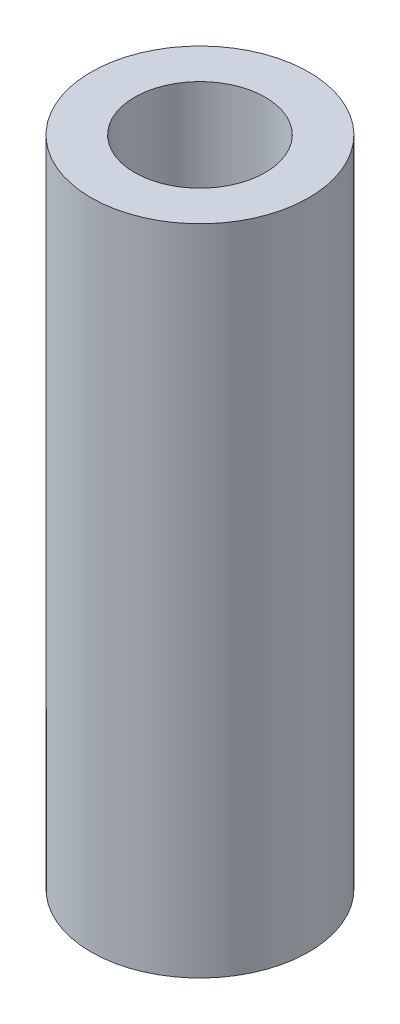
ISO-10303-21;
HEADER;
FILE_DESCRIPTION(('STEP AP214'),'2;1');
FILE_NAME('part.step','',(''),(''),'','','');
FILE_SCHEMA(('AUTOMOTIVE_DESIGN { 1 0 10303 214 1 1 1 1 }'));
ENDSEC;
DATA;
#1=APPLICATION_CONTEXT('core data for automotive mechanical design processes');
#2=APPLICATION_PROTOCOL_DEFINITION('international standard','automotive_design',2000,#1);
#3=PRODUCT_CONTEXT('',#1,'mechanical');
#4=PRODUCT('Part','Part','',(#3));
#5=PRODUCT_RELATED_PRODUCT_CATEGORY('part','',(#4));
#6=PRODUCT_DEFINITION_FORMATION('','',#4);
#7=PRODUCT_DEFINITION_CONTEXT('part definition',#1,'design');
#8=PRODUCT_DEFINITION('design','',#6,#7);
#9=PRODUCT_DEFINITION_SHAPE('','',#8);
#10=(LENGTH_UNIT() NAMED_UNIT(*) SI_UNIT(.MILLI.,.METRE.));
#11=(NAMED_UNIT(*) PLANE_ANGLE_UNIT() SI_UNIT($,.RADIAN.));
#12=(NAMED_UNIT(*) SI_UNIT($,.STERADIAN.) SOLID_ANGLE_UNIT());
#13=UNCERTAINTY_MEASURE_WITH_UNIT(LENGTH_MEASURE(1.E-05),#10,'distance_accuracy_value','');
#14=(GEOMETRIC_REPRESENTATION_CONTEXT(3) GLOBAL_UNCERTAINTY_ASSIGNED_CONTEXT((#13)) GLOBAL_UNIT_ASSIGNED_CONTEXT((#10,
#11,#12)) REPRESENTATION_CONTEXT('',''));
#15=CARTESIAN_POINT('',(0.,0.,0.));
#16=DIRECTION('',(0.,0.,1.));
#17=DIRECTION('',(1.,0.,0.));
#18=AXIS2_PLACEMENT_3D('',#15,#16,#17);
#19=CARTESIAN_POINT('',(0.,75.,0.));
#20=DIRECTION('',(0.,-1.,0.));
#21=DIRECTION('',(0.,0.,-1.));
#22=AXIS2_PLACEMENT_3D('',#19,#20,#21);
#23=CYLINDRICAL_SURFACE('',#22,25.);
#24=CARTESIAN_POINT('',(0.,75.,0.));
#25=DIRECTION('',(0.,1.,0.));
#26=DIRECTION('',(0.,0.,1.));
#27=AXIS2_PLACEMENT_3D('',#24,#25,#26);
#28=CIRCLE('',#27,25.);
#29=CARTESIAN_POINT('',(0.,75.,25.));
#30=VERTEX_POINT('',#29);
#31=EDGE_CURVE('E10',#30,#30,#28,.T.);
#32=ORIENTED_EDGE('',*,*,#31,.F.);
#33=EDGE_LOOP('',(#32));
#34=FACE_BOUND('',#33,.T.);
#35=CARTESIAN_POINT('',(0.,-75.,0.));
#36=DIRECTION('',(0.,1.,0.));
#37=DIRECTION('',(0.,0.,1.));
#38=AXIS2_PLACEMENT_3D('',#35,#36,#37);
#39=CIRCLE('',#38,25.);
#40=CARTESIAN_POINT('',(0.,-75.,25.));
#41=VERTEX_POINT('',#40);
#42=EDGE_CURVE('E40',#41,#41,#39,.T.);
#43=ORIENTED_EDGE('',*,*,#42,.T.);
#44=EDGE_LOOP('',(#43));
#45=FACE_BOUND('',#44,.T.);
#46=ADVANCED_FACE('F37',(#34,#45),#23,.T.);
#47=CARTESIAN_POINT('',(0.,75.,0.));
#48=DIRECTION('',(0.,1.,0.));
#49=DIRECTION('',(0.,0.,1.));
#50=AXIS2_PLACEMENT_3D('',#47,#48,#49);
#51=PLANE('',#50);
#52=CARTESIAN_POINT('',(0.,75.,0.));
#53=DIRECTION('',(0.,1.,0.));
#54=DIRECTION('',(0.,0.,1.));
#55=AXIS2_PLACEMENT_3D('',#52,#53,#54);
#56=CIRCLE('',#55,15.);
#57=CARTESIAN_POINT('',(0.,75.,15.));
#58=VERTEX_POINT('',#57);
#59=EDGE_CURVE('E51',#58,#58,#56,.T.);
#60=ORIENTED_EDGE('',*,*,#59,.F.);
#61=EDGE_LOOP('',(#60));
#62=FACE_BOUND('',#61,.T.);
#63=ORIENTED_EDGE('',*,*,#31,.T.);
#64=EDGE_LOOP('',(#63));
#65=FACE_BOUND('',#64,.T.);
#66=ADVANCED_FACE('F68',(#62,#65),#51,.T.);
#67=CARTESIAN_POINT('',(0.,-75.,0.));
#68=DIRECTION('',(0.,1.,0.));
#69=DIRECTION('',(0.,0.,1.));
#70=AXIS2_PLACEMENT_3D('',#67,#68,#69);
#71=PLANE('',#70);
#72=CARTESIAN_POINT('',(0.,-75.,0.));
#73=DIRECTION('',(0.,1.,0.));
#74=DIRECTION('',(0.,0.,1.));
#75=AXIS2_PLACEMENT_3D('',#72,#73,#74);
#76=CIRCLE('',#75,15.);
#77=CARTESIAN_POINT('',(0.,-75.,15.));
#78=VERTEX_POINT('',#77);
#79=EDGE_CURVE('E49',#78,#78,#76,.T.);
#80=ORIENTED_EDGE('',*,*,#79,.T.);
#81=EDGE_LOOP('',(#80));
#82=FACE_BOUND('',#81,.T.);
#83=ORIENTED_EDGE('',*,*,#42,.F.);
#84=EDGE_LOOP('',(#83));
#85=FACE_BOUND('',#84,.T.);
#86=ADVANCED_FACE('F59',(#82,#85),#71,.F.);
#87=CARTESIAN_POINT('',(0.,-75.,0.));
#88=DIRECTION('',(0.,1.,0.));
#89=DIRECTION('',(0.,0.,1.));
#90=AXIS2_PLACEMENT_3D('',#87,#88,#89);
#91=CYLINDRICAL_SURFACE('',#90,15.);
#92=ORIENTED_EDGE('',*,*,#79,.F.);
#93=EDGE_LOOP('',(#92));
#94=FACE_BOUND('',#93,.T.);
#95=ORIENTED_EDGE('',*,*,#59,.T.);
#96=EDGE_LOOP('',(#95));
#97=FACE_BOUND('',#96,.T.);
#98=ADVANCED_FACE('F62',(#94,#97),#91,.F.);
#99=CLOSED_SHELL('',(#46,#66,#86,#98));
#100=MANIFOLD_SOLID_BREP('B2',#99);
#101=ADVANCED_BREP_SHAPE_REPRESENTATION('',(#18,#100),#14);
#102=SHAPE_DEFINITION_REPRESENTATION(#9,#101);
ENDSEC;
END-ISO-10303-21;
